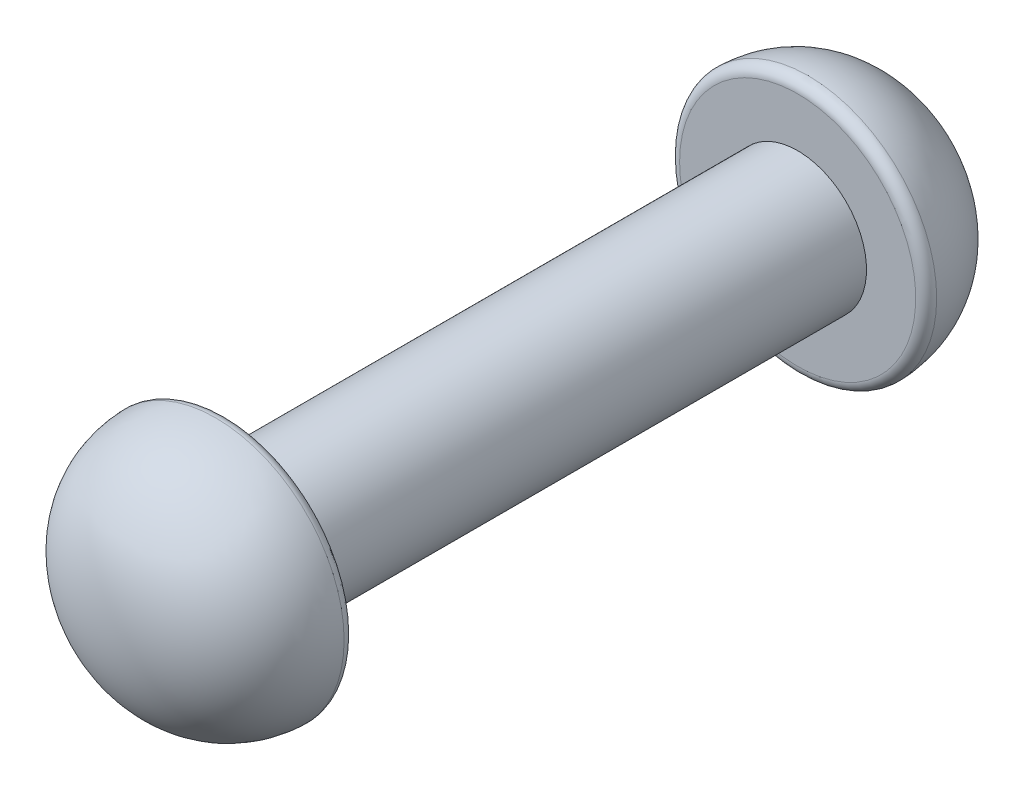
ISO-10303-21;
HEADER;
FILE_DESCRIPTION(('STEP AP214'),'2;1');
FILE_NAME('part.step','',(''),(''),'','','');
FILE_SCHEMA(('AUTOMOTIVE_DESIGN { 1 0 10303 214 1 1 1 1 }'));
ENDSEC;
DATA;
#1=APPLICATION_CONTEXT('core data for automotive mechanical design processes');
#2=APPLICATION_PROTOCOL_DEFINITION('international standard','automotive_design',2000,#1);
#3=PRODUCT_CONTEXT('',#1,'mechanical');
#4=PRODUCT('Part','Part','',(#3));
#5=PRODUCT_RELATED_PRODUCT_CATEGORY('part','',(#4));
#6=PRODUCT_DEFINITION_FORMATION('','',#4);
#7=PRODUCT_DEFINITION_CONTEXT('part definition',#1,'design');
#8=PRODUCT_DEFINITION('design','',#6,#7);
#9=PRODUCT_DEFINITION_SHAPE('','',#8);
#10=(LENGTH_UNIT() NAMED_UNIT(*) SI_UNIT(.MILLI.,.METRE.));
#11=(NAMED_UNIT(*) PLANE_ANGLE_UNIT() SI_UNIT($,.RADIAN.));
#12=(NAMED_UNIT(*) SI_UNIT($,.STERADIAN.) SOLID_ANGLE_UNIT());
#13=UNCERTAINTY_MEASURE_WITH_UNIT(LENGTH_MEASURE(1.E-05),#10,'distance_accuracy_value','');
#14=(GEOMETRIC_REPRESENTATION_CONTEXT(3) GLOBAL_UNCERTAINTY_ASSIGNED_CONTEXT((#13)) GLOBAL_UNIT_ASSIGNED_CONTEXT((#10,
#11,#12)) REPRESENTATION_CONTEXT('',''));
#15=CARTESIAN_POINT('',(0.,0.,0.));
#16=DIRECTION('',(0.,0.,1.));
#17=DIRECTION('',(1.,0.,0.));
#18=AXIS2_PLACEMENT_3D('',#15,#16,#17);
#19=CARTESIAN_POINT('',(0.,0.,8.3));
#20=DIRECTION('',(0.,0.,-1.));
#21=DIRECTION('',(-1.,0.,0.));
#22=AXIS2_PLACEMENT_3D('',#19,#20,#21);
#23=CYLINDRICAL_SURFACE('',#22,1.);
#24=CARTESIAN_POINT('',(0.,0.,8.3));
#25=DIRECTION('',(0.,0.,1.));
#26=DIRECTION('',(1.,0.,0.));
#27=AXIS2_PLACEMENT_3D('',#24,#25,#26);
#28=CIRCLE('',#27,1.);
#29=CARTESIAN_POINT('',(-1.,0.,8.3));
#30=VERTEX_POINT('',#29);
#31=EDGE_CURVE('E96',#30,#30,#28,.T.);
#32=CARTESIAN_POINT('',(0.,0.,0.));
#33=DIRECTION('',(0.,0.,-1.));
#34=DIRECTION('',(-1.,0.,0.));
#35=AXIS2_PLACEMENT_3D('',#32,#33,#34);
#36=CIRCLE('',#35,1.);
#37=CARTESIAN_POINT('',(-1.,0.,0.));
#38=VERTEX_POINT('',#37);
#39=EDGE_CURVE('E102',#38,#38,#36,.T.);
#40=CARTESIAN_POINT('',(-1.,0.,8.3));
#41=CARTESIAN_POINT('',(-1.,0.,8.21354166666667));
#42=CARTESIAN_POINT('',(-1.,0.,8.12708333333333));
#43=CARTESIAN_POINT('',(-1.,0.,7.95416666666667));
#44=CARTESIAN_POINT('',(-1.,0.,7.86770833333333));
#45=CARTESIAN_POINT('',(-1.,0.,7.69479166666667));
#46=CARTESIAN_POINT('',(-1.,0.,7.60833333333333));
#47=CARTESIAN_POINT('',(-1.,0.,7.43541666666667));
#48=CARTESIAN_POINT('',(-1.,0.,7.34895833333333));
#49=CARTESIAN_POINT('',(-1.,0.,7.17604166666667));
#50=CARTESIAN_POINT('',(-1.,0.,7.08958333333333));
#51=CARTESIAN_POINT('',(-1.,0.,6.91666666666667));
#52=CARTESIAN_POINT('',(-1.,0.,6.83020833333333));
#53=CARTESIAN_POINT('',(-1.,0.,6.65729166666667));
#54=CARTESIAN_POINT('',(-1.,0.,6.57083333333333));
#55=CARTESIAN_POINT('',(-1.,0.,6.39791666666667));
#56=CARTESIAN_POINT('',(-1.,0.,6.31145833333333));
#57=CARTESIAN_POINT('',(-1.,0.,6.13854166666667));
#58=CARTESIAN_POINT('',(-1.,0.,6.05208333333333));
#59=CARTESIAN_POINT('',(-1.,0.,5.87916666666667));
#60=CARTESIAN_POINT('',(-1.,0.,5.79270833333333));
#61=CARTESIAN_POINT('',(-1.,0.,5.61979166666667));
#62=CARTESIAN_POINT('',(-1.,0.,5.53333333333333));
#63=CARTESIAN_POINT('',(-1.,0.,5.36041666666666));
#64=CARTESIAN_POINT('',(-1.,0.,5.27395833333333));
#65=CARTESIAN_POINT('',(-1.,0.,5.10104166666667));
#66=CARTESIAN_POINT('',(-1.,0.,5.01458333333333));
#67=CARTESIAN_POINT('',(-1.,0.,4.84166666666667));
#68=CARTESIAN_POINT('',(-1.,0.,4.75520833333333));
#69=CARTESIAN_POINT('',(-1.,0.,4.58229166666667));
#70=CARTESIAN_POINT('',(-1.,0.,4.49583333333333));
#71=CARTESIAN_POINT('',(-1.,0.,4.32291666666667));
#72=CARTESIAN_POINT('',(-1.,0.,4.23645833333333));
#73=CARTESIAN_POINT('',(-1.,0.,4.06354166666667));
#74=CARTESIAN_POINT('',(-1.,0.,3.97708333333333));
#75=CARTESIAN_POINT('',(-1.,0.,3.80416666666667));
#76=CARTESIAN_POINT('',(-1.,0.,3.71770833333333));
#77=CARTESIAN_POINT('',(-1.,0.,3.54479166666667));
#78=CARTESIAN_POINT('',(-1.,0.,3.45833333333333));
#79=CARTESIAN_POINT('',(-1.,0.,3.28541666666667));
#80=CARTESIAN_POINT('',(-1.,0.,3.19895833333333));
#81=CARTESIAN_POINT('',(-1.,0.,3.02604166666667));
#82=CARTESIAN_POINT('',(-1.,0.,2.93958333333333));
#83=CARTESIAN_POINT('',(-1.,0.,2.76666666666667));
#84=CARTESIAN_POINT('',(-1.,0.,2.68020833333333));
#85=CARTESIAN_POINT('',(-1.,0.,2.50729166666667));
#86=CARTESIAN_POINT('',(-1.,0.,2.42083333333333));
#87=CARTESIAN_POINT('',(-1.,0.,2.24791666666667));
#88=CARTESIAN_POINT('',(-1.,0.,2.16145833333333));
#89=CARTESIAN_POINT('',(-1.,0.,1.98854166666667));
#90=CARTESIAN_POINT('',(-1.,0.,1.90208333333333));
#91=CARTESIAN_POINT('',(-1.,0.,1.72916666666667));
#92=CARTESIAN_POINT('',(-1.,0.,1.64270833333333));
#93=CARTESIAN_POINT('',(-1.,0.,1.46979166666667));
#94=CARTESIAN_POINT('',(-1.,0.,1.38333333333333));
#95=CARTESIAN_POINT('',(-1.,0.,1.21041666666667));
#96=CARTESIAN_POINT('',(-1.,0.,1.12395833333333));
#97=CARTESIAN_POINT('',(-1.,0.,0.951041666666665));
#98=CARTESIAN_POINT('',(-1.,0.,0.864583333333332));
#99=CARTESIAN_POINT('',(-1.,0.,0.691666666666665));
#100=CARTESIAN_POINT('',(-1.,0.,0.605208333333332));
#101=CARTESIAN_POINT('',(-1.,0.,0.432291666666665));
#102=CARTESIAN_POINT('',(-1.,0.,0.345833333333332));
#103=CARTESIAN_POINT('',(-1.,0.,0.172916666666666));
#104=CARTESIAN_POINT('',(-1.,0.,0.086458333333333));
#105=CARTESIAN_POINT('',(-1.,0.,0.));
#106=B_SPLINE_CURVE_WITH_KNOTS('',3,(#40,#41,#42,#43,#44,#45,#46,#47,#48,#49,#50,#51,#52,#53,
#54,#55,#56,#57,#58,#59,#60,#61,#62,#63,#64,#65,#66,#67,#68,#69,#70,#71,#72,#73,#74,#75,#76,#77,
#78,#79,#80,#81,#82,#83,#84,#85,#86,#87,#88,#89,#90,#91,#92,#93,#94,#95,#96,#97,#98,#99,#100,
#101,#102,#103,#104,#105),.UNSPECIFIED.,.F.,.F.,(4,2,2,2,2,2,2,2,2,2,2,2,2,2,2,2,2,2,2,2,2,2,2,
2,2,2,2,2,2,2,2,2,4),(0.,0.259375000000001,0.518750000000001,0.778125000000001,1.0375,1.296875,
1.55625,1.815625,2.075,2.334375,2.59375,2.853125,3.1125,3.371875,3.63125,3.890625,4.15,4.409375,
4.66875,4.928125,5.1875,5.446875,5.70625,5.965625,6.225,6.484375,6.74375,7.003125,7.2625,
7.521875,7.78125,8.040625,8.3),.UNSPECIFIED.);
#107=EDGE_CURVE('BSEAM39',#30,#38,#106,.T.);
#108=ORIENTED_EDGE('',*,*,#31,.F.);
#109=ORIENTED_EDGE('',*,*,#39,.F.);
#110=ORIENTED_EDGE('',*,*,#107,.T.);
#111=ORIENTED_EDGE('',*,*,#107,.F.);
#112=EDGE_LOOP('',(#108,#110,#109,#111));
#113=FACE_BOUND('',#112,.T.);
#114=ADVANCED_FACE('F39',(#113),#23,.T.);
#115=CARTESIAN_POINT('',(1.86246764035647,0.,0.));
#116=CARTESIAN_POINT('',(1.9167519747919,0.,-0.840718666447527));
#117=CARTESIAN_POINT('',(1.32981532420152,0.,-1.70850995734021));
#118=CARTESIAN_POINT('',(0.,0.,-1.70850995734021));
#119=B_SPLINE_CURVE_WITH_KNOTS('',3,(#115,#116,#117,#118),.UNSPECIFIED.,.F.,.F.,(4,4),(0.,1.),.UNSPECIFIED.);
#120=CARTESIAN_POINT('',(0.,0.,-4.83628768685651));
#121=DIRECTION('',(0.,0.,-1.));
#122=AXIS1_PLACEMENT('',#120,#121);
#123=SURFACE_OF_REVOLUTION('',#119,#122);
#124=CARTESIAN_POINT('',(0.,0.,-0.154377048085529));
#125=DIRECTION('',(0.,0.,-1.));
#126=DIRECTION('',(-1.,0.,0.));
#127=AXIS2_PLACEMENT_3D('',#124,#125,#126);
#128=CIRCLE('',#127,1.86520825605128);
#129=CARTESIAN_POINT('',(-1.86520825605128,0.,-0.154377048085529));
#130=VERTEX_POINT('',#129);
#131=EDGE_CURVE('E48',#130,#130,#128,.T.);
#132=ORIENTED_EDGE('',*,*,#131,.T.);
#133=EDGE_LOOP('',(#132));
#134=FACE_BOUND('',#133,.T.);
#135=CARTESIAN_POINT('',(0.,0.,-1.70850995734021));
#136=VERTEX_POINT('',#135);
#137=VERTEX_LOOP('',#136);
#138=FACE_BOUND('',#137,.T.);
#139=ADVANCED_FACE('F67',(#134,#138),#123,.T.);
#140=CARTESIAN_POINT('',(0.,0.,0.));
#141=DIRECTION('',(0.,0.,-1.));
#142=DIRECTION('',(-1.,0.,0.));
#143=AXIS2_PLACEMENT_3D('',#140,#141,#142);
#144=PLANE('',#143);
#145=CARTESIAN_POINT('',(0.,0.,0.));
#146=DIRECTION('',(0.,0.,-1.));
#147=DIRECTION('',(-1.,0.,0.));
#148=AXIS2_PLACEMENT_3D('',#145,#146,#147);
#149=CIRCLE('',#148,1.71527213148466);
#150=CARTESIAN_POINT('',(-1.71527213148466,0.,0.));
#151=VERTEX_POINT('',#150);
#152=EDGE_CURVE('E11',#151,#151,#149,.F.);
#153=ORIENTED_EDGE('',*,*,#152,.T.);
#154=EDGE_LOOP('',(#153));
#155=FACE_BOUND('',#154,.T.);
#156=ORIENTED_EDGE('',*,*,#39,.T.);
#157=EDGE_LOOP('',(#156));
#158=FACE_BOUND('',#157,.T.);
#159=ADVANCED_FACE('F57',(#155,#158),#144,.F.);
#160=CARTESIAN_POINT('',(0.,0.,10.0085099573402));
#161=CARTESIAN_POINT('',(1.32981532420152,0.,10.0085099573402));
#162=CARTESIAN_POINT('',(1.9167519747919,0.,9.14071866644753));
#163=CARTESIAN_POINT('',(1.86246764035647,0.,8.30000000000001));
#164=B_SPLINE_CURVE_WITH_KNOTS('',3,(#160,#161,#162,#163),.UNSPECIFIED.,.F.,.F.,(4,4),(0.,1.),.UNSPECIFIED.);
#165=CARTESIAN_POINT('',(0.,0.,-4.83628768685651));
#166=DIRECTION('',(0.,0.,-1.));
#167=AXIS1_PLACEMENT('',#165,#166);
#168=SURFACE_OF_REVOLUTION('',#164,#167);
#169=CARTESIAN_POINT('',(0.,0.,8.45437704808554));
#170=DIRECTION('',(0.,0.,-1.));
#171=DIRECTION('',(-1.,0.,0.));
#172=AXIS2_PLACEMENT_3D('',#169,#170,#171);
#173=CIRCLE('',#172,1.86520825605128);
#174=CARTESIAN_POINT('',(-1.86520825605128,0.,8.45437704808554));
#175=VERTEX_POINT('',#174);
#176=EDGE_CURVE('E91',#175,#175,#173,.F.);
#177=ORIENTED_EDGE('',*,*,#176,.T.);
#178=EDGE_LOOP('',(#177));
#179=FACE_BOUND('',#178,.T.);
#180=CARTESIAN_POINT('',(0.,0.,10.0085099573402));
#181=VERTEX_POINT('',#180);
#182=VERTEX_LOOP('',#181);
#183=FACE_BOUND('',#182,.T.);
#184=ADVANCED_FACE('F54',(#179,#183),#168,.T.);
#185=CARTESIAN_POINT('',(0.,0.,8.30000000000001));
#186=DIRECTION('',(0.,0.,1.));
#187=DIRECTION('',(1.,0.,0.));
#188=AXIS2_PLACEMENT_3D('',#185,#186,#187);
#189=PLANE('',#188);
#190=CARTESIAN_POINT('',(0.,0.,8.30000000000001));
#191=DIRECTION('',(0.,0.,1.));
#192=DIRECTION('',(1.,0.,0.));
#193=AXIS2_PLACEMENT_3D('',#190,#191,#192);
#194=CIRCLE('',#193,1.71527213148466);
#195=CARTESIAN_POINT('',(1.71527213148466,0.,8.30000000000001));
#196=VERTEX_POINT('',#195);
#197=EDGE_CURVE('E94',#196,#196,#194,.F.);
#198=ORIENTED_EDGE('',*,*,#197,.T.);
#199=EDGE_LOOP('',(#198));
#200=FACE_BOUND('',#199,.T.);
#201=ORIENTED_EDGE('',*,*,#31,.T.);
#202=EDGE_LOOP('',(#201));
#203=FACE_BOUND('',#202,.T.);
#204=ADVANCED_FACE('F56',(#200,#203),#189,.F.);
#205=CARTESIAN_POINT('',(0.,0.,8.45000000000001));
#206=DIRECTION('',(0.,0.,-1.));
#207=DIRECTION('',(-1.,0.,0.));
#208=AXIS2_PLACEMENT_3D('',#205,#206,#207);
#209=TOROIDAL_SURFACE('',#208,1.71527213148466,0.15);
#210=ORIENTED_EDGE('',*,*,#176,.F.);
#211=EDGE_LOOP('',(#210));
#212=FACE_BOUND('',#211,.T.);
#213=ORIENTED_EDGE('',*,*,#197,.F.);
#214=EDGE_LOOP('',(#213));
#215=FACE_BOUND('',#214,.T.);
#216=ADVANCED_FACE('F64',(#212,#215),#209,.T.);
#217=CARTESIAN_POINT('',(0.,0.,-0.15));
#218=DIRECTION('',(0.,0.,-1.));
#219=DIRECTION('',(-1.,0.,0.));
#220=AXIS2_PLACEMENT_3D('',#217,#218,#219);
#221=TOROIDAL_SURFACE('',#220,1.71527213148466,0.15);
#222=ORIENTED_EDGE('',*,*,#152,.F.);
#223=EDGE_LOOP('',(#222));
#224=FACE_BOUND('',#223,.T.);
#225=ORIENTED_EDGE('',*,*,#131,.F.);
#226=EDGE_LOOP('',(#225));
#227=FACE_BOUND('',#226,.T.);
#228=ADVANCED_FACE('F41',(#224,#227),#221,.T.);
#229=CLOSED_SHELL('',(#114,#139,#159,#184,#204,#216,#228));
#230=MANIFOLD_SOLID_BREP('B2',#229);
#231=ADVANCED_BREP_SHAPE_REPRESENTATION('',(#18,#230),#14);
#232=SHAPE_DEFINITION_REPRESENTATION(#9,#231);
ENDSEC;
END-ISO-10303-21;
